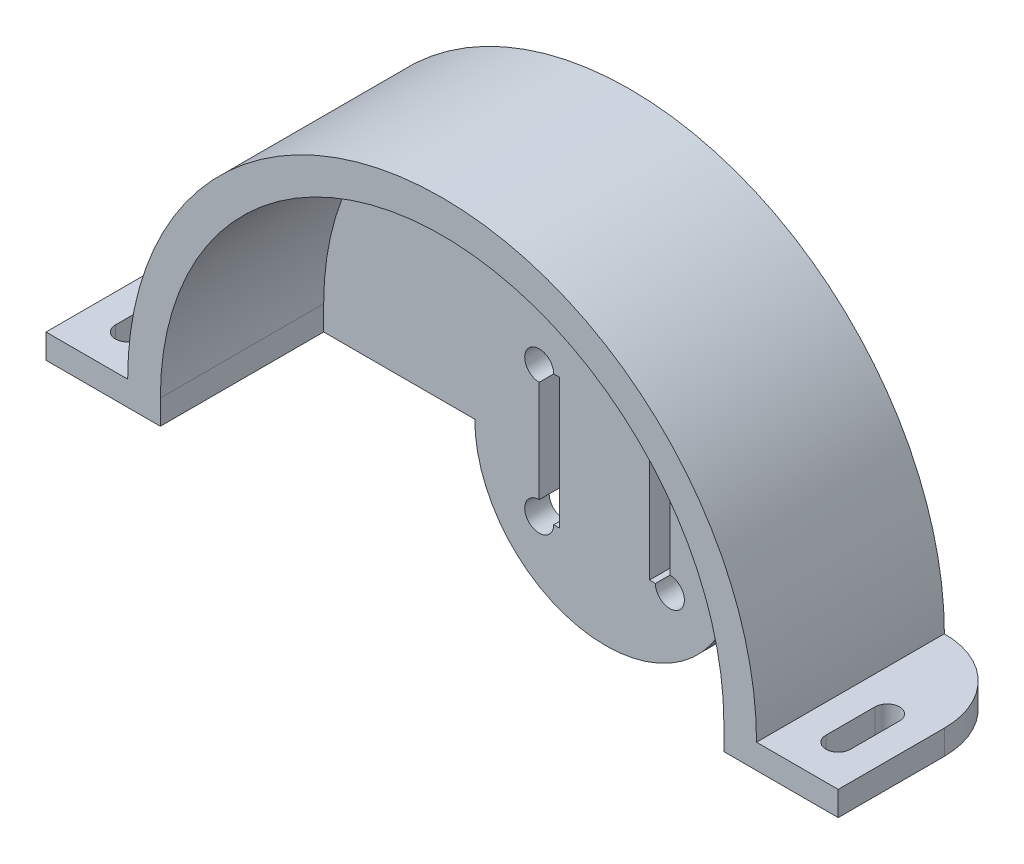
ISO-10303-21;
HEADER;
FILE_DESCRIPTION(('STEP AP214'),'2;1');
FILE_NAME('part.step','',(''),(''),'','','');
FILE_SCHEMA(('AUTOMOTIVE_DESIGN { 1 0 10303 214 1 1 1 1 }'));
ENDSEC;
DATA;
#1=APPLICATION_CONTEXT('core data for automotive mechanical design processes');
#2=APPLICATION_PROTOCOL_DEFINITION('international standard','automotive_design',2000,#1);
#3=PRODUCT_CONTEXT('',#1,'mechanical');
#4=PRODUCT('Part','Part','',(#3));
#5=PRODUCT_RELATED_PRODUCT_CATEGORY('part','',(#4));
#6=PRODUCT_DEFINITION_FORMATION('','',#4);
#7=PRODUCT_DEFINITION_CONTEXT('part definition',#1,'design');
#8=PRODUCT_DEFINITION('design','',#6,#7);
#9=PRODUCT_DEFINITION_SHAPE('','',#8);
#10=(LENGTH_UNIT() NAMED_UNIT(*) SI_UNIT(.MILLI.,.METRE.));
#11=(NAMED_UNIT(*) PLANE_ANGLE_UNIT() SI_UNIT($,.RADIAN.));
#12=(NAMED_UNIT(*) SI_UNIT($,.STERADIAN.) SOLID_ANGLE_UNIT());
#13=UNCERTAINTY_MEASURE_WITH_UNIT(LENGTH_MEASURE(1.E-05),#10,'distance_accuracy_value','');
#14=(GEOMETRIC_REPRESENTATION_CONTEXT(3) GLOBAL_UNCERTAINTY_ASSIGNED_CONTEXT((#13)) GLOBAL_UNIT_ASSIGNED_CONTEXT((#10,
#11,#12)) REPRESENTATION_CONTEXT('',''));
#15=CARTESIAN_POINT('',(0.,0.,0.));
#16=DIRECTION('',(0.,0.,1.));
#17=DIRECTION('',(1.,0.,0.));
#18=AXIS2_PLACEMENT_3D('',#15,#16,#17);
#19=CARTESIAN_POINT('',(0.,-3.,3.));
#20=DIRECTION('',(0.,1.,0.));
#21=DIRECTION('',(0.,0.,1.));
#22=AXIS2_PLACEMENT_3D('',#19,#20,#21);
#23=PLANE('',#22);
#24=DIRECTION('',(0.,0.,1.));
#25=VECTOR('',#24,1.);
#26=CARTESIAN_POINT('',(90.5,-3.,3.));
#27=LINE('',#26,#25);
#28=CARTESIAN_POINT('',(90.5,-3.,12.));
#29=VERTEX_POINT('',#28);
#30=CARTESIAN_POINT('',(90.5,-3.,18.));
#31=VERTEX_POINT('',#30);
#32=EDGE_CURVE('E413',#29,#31,#27,.T.);
#33=ORIENTED_EDGE('',*,*,#32,.T.);
#34=CARTESIAN_POINT('',(92.,-3.,18.));
#35=DIRECTION('',(0.,1.,0.));
#36=DIRECTION('',(0.,0.,1.));
#37=AXIS2_PLACEMENT_3D('',#34,#35,#36);
#38=CIRCLE('',#37,1.5);
#39=CARTESIAN_POINT('',(93.5,-3.,18.));
#40=VERTEX_POINT('',#39);
#41=EDGE_CURVE('E416',#31,#40,#38,.T.);
#42=ORIENTED_EDGE('',*,*,#41,.T.);
#43=DIRECTION('',(0.,0.,-1.));
#44=VECTOR('',#43,1.);
#45=CARTESIAN_POINT('',(93.5,-3.,3.));
#46=LINE('',#45,#44);
#47=CARTESIAN_POINT('',(93.5,-3.,12.));
#48=VERTEX_POINT('',#47);
#49=EDGE_CURVE('E383',#40,#48,#46,.T.);
#50=ORIENTED_EDGE('',*,*,#49,.T.);
#51=CARTESIAN_POINT('',(92.,-3.,12.));
#52=DIRECTION('',(0.,1.,0.));
#53=DIRECTION('',(0.,0.,1.));
#54=AXIS2_PLACEMENT_3D('',#51,#52,#53);
#55=CIRCLE('',#54,1.5);
#56=EDGE_CURVE('E410',#48,#29,#55,.T.);
#57=ORIENTED_EDGE('',*,*,#56,.T.);
#58=EDGE_LOOP('',(#33,#42,#50,#57));
#59=FACE_BOUND('',#58,.T.);
#60=DIRECTION('',(1.,0.,0.));
#61=VECTOR('',#60,1.);
#62=CARTESIAN_POINT('',(0.,-3.,0.));
#63=LINE('',#62,#61);
#64=CARTESIAN_POINT('',(64.5,-3.00000000000001,0.));
#65=VERTEX_POINT('',#64);
#66=CARTESIAN_POINT('',(87.,-3.,0.));
#67=VERTEX_POINT('',#66);
#68=EDGE_CURVE('E486',#65,#67,#63,.T.);
#69=ORIENTED_EDGE('',*,*,#68,.T.);
#70=CARTESIAN_POINT('',(87.,-3.,10.));
#71=DIRECTION('',(0.,1.,0.));
#72=DIRECTION('',(0.,0.,1.));
#73=AXIS2_PLACEMENT_3D('',#70,#71,#72);
#74=CIRCLE('',#73,10.);
#75=CARTESIAN_POINT('',(97.,-3.,10.));
#76=VERTEX_POINT('',#75);
#77=EDGE_CURVE('E549',#67,#76,#74,.F.);
#78=ORIENTED_EDGE('',*,*,#77,.T.);
#79=DIRECTION('',(0.,0.,-1.));
#80=VECTOR('',#79,1.);
#81=CARTESIAN_POINT('',(97.,-3.,3.));
#82=LINE('',#81,#80);
#83=CARTESIAN_POINT('',(97.,-3.,23.));
#84=VERTEX_POINT('',#83);
#85=EDGE_CURVE('E494',#84,#76,#82,.T.);
#86=ORIENTED_EDGE('',*,*,#85,.F.);
#87=DIRECTION('',(1.,0.,0.));
#88=VECTOR('',#87,1.);
#89=CARTESIAN_POINT('',(0.,-3.,23.));
#90=LINE('',#89,#88);
#91=CARTESIAN_POINT('',(83.,-3.,23.));
#92=VERTEX_POINT('',#91);
#93=EDGE_CURVE('E440',#92,#84,#90,.T.);
#94=ORIENTED_EDGE('',*,*,#93,.F.);
#95=DIRECTION('',(0.,0.,-1.));
#96=VECTOR('',#95,1.);
#97=CARTESIAN_POINT('',(83.,-3.,23.));
#98=LINE('',#97,#96);
#99=CARTESIAN_POINT('',(83.,-3.,3.));
#100=VERTEX_POINT('',#99);
#101=EDGE_CURVE('E469',#92,#100,#98,.T.);
#102=ORIENTED_EDGE('',*,*,#101,.T.);
#103=DIRECTION('',(1.,0.,0.));
#104=VECTOR('',#103,1.);
#105=CARTESIAN_POINT('',(0.,-3.,3.));
#106=LINE('',#105,#104);
#107=CARTESIAN_POINT('',(64.5,-3.,3.));
#108=VERTEX_POINT('',#107);
#109=EDGE_CURVE('E483',#108,#100,#106,.T.);
#110=ORIENTED_EDGE('',*,*,#109,.F.);
#111=DIRECTION('',(0.,0.,-1.));
#112=VECTOR('',#111,1.);
#113=CARTESIAN_POINT('',(64.5,-3.00000000000001,3.));
#114=LINE('',#113,#112);
#115=EDGE_CURVE('E426',#108,#65,#114,.T.);
#116=ORIENTED_EDGE('',*,*,#115,.T.);
#117=EDGE_LOOP('',(#69,#78,#86,#94,#102,#110,#116));
#118=FACE_BOUND('',#117,.T.);
#119=ADVANCED_FACE('F75',(#59,#118),#23,.F.);
#120=CARTESIAN_POINT('',(48.5,0.,3.));
#121=DIRECTION('',(0.,0.,-1.));
#122=DIRECTION('',(-1.,0.,0.));
#123=AXIS2_PLACEMENT_3D('',#120,#121,#122);
#124=CYLINDRICAL_SURFACE('',#123,38.5);
#125=CARTESIAN_POINT('',(48.5,0.,0.));
#126=DIRECTION('',(0.,0.,1.));
#127=DIRECTION('',(1.,0.,0.));
#128=AXIS2_PLACEMENT_3D('',#125,#126,#127);
#129=CIRCLE('',#128,38.5);
#130=CARTESIAN_POINT('',(10.,0.,0.));
#131=VERTEX_POINT('',#130);
#132=CARTESIAN_POINT('',(87.,0.,0.));
#133=VERTEX_POINT('',#132);
#134=EDGE_CURVE('E478',#131,#133,#129,.F.);
#135=ORIENTED_EDGE('',*,*,#134,.F.);
#136=DIRECTION('',(0.,0.,-1.));
#137=VECTOR('',#136,1.);
#138=CARTESIAN_POINT('',(10.,0.,3.));
#139=LINE('',#138,#137);
#140=CARTESIAN_POINT('',(10.,0.,23.));
#141=VERTEX_POINT('',#140);
#142=EDGE_CURVE('E501',#141,#131,#139,.T.);
#143=ORIENTED_EDGE('',*,*,#142,.F.);
#144=CARTESIAN_POINT('',(48.5,0.,23.));
#145=DIRECTION('',(0.,0.,1.));
#146=DIRECTION('',(1.,0.,0.));
#147=AXIS2_PLACEMENT_3D('',#144,#145,#146);
#148=CIRCLE('',#147,38.5);
#149=CARTESIAN_POINT('',(87.,0.,23.));
#150=VERTEX_POINT('',#149);
#151=EDGE_CURVE('E449',#150,#141,#148,.T.);
#152=ORIENTED_EDGE('',*,*,#151,.F.);
#153=DIRECTION('',(0.,0.,-1.));
#154=VECTOR('',#153,1.);
#155=CARTESIAN_POINT('',(87.,0.,3.));
#156=LINE('',#155,#154);
#157=EDGE_CURVE('E482',#150,#133,#156,.T.);
#158=ORIENTED_EDGE('',*,*,#157,.T.);
#159=EDGE_LOOP('',(#135,#143,#152,#158));
#160=FACE_BOUND('',#159,.T.);
#161=ADVANCED_FACE('F568',(#160),#124,.T.);
#162=CARTESIAN_POINT('',(0.,0.,3.));
#163=DIRECTION('',(0.,1.,0.));
#164=DIRECTION('',(0.,0.,1.));
#165=AXIS2_PLACEMENT_3D('',#162,#163,#164);
#166=PLANE('',#165);
#167=CARTESIAN_POINT('',(5.,0.,18.));
#168=DIRECTION('',(0.,1.,0.));
#169=DIRECTION('',(-1.,0.,0.));
#170=AXIS2_PLACEMENT_3D('',#167,#168,#169);
#171=CIRCLE('',#170,1.5);
#172=CARTESIAN_POINT('',(3.5,0.,18.));
#173=VERTEX_POINT('',#172);
#174=CARTESIAN_POINT('',(6.5,0.,18.));
#175=VERTEX_POINT('',#174);
#176=EDGE_CURVE('E368',#173,#175,#171,.T.);
#177=ORIENTED_EDGE('',*,*,#176,.F.);
#178=DIRECTION('',(0.,0.,1.));
#179=VECTOR('',#178,1.);
#180=CARTESIAN_POINT('',(3.5,0.,18.));
#181=LINE('',#180,#179);
#182=CARTESIAN_POINT('',(3.5,0.,12.));
#183=VERTEX_POINT('',#182);
#184=EDGE_CURVE('E377',#183,#173,#181,.T.);
#185=ORIENTED_EDGE('',*,*,#184,.F.);
#186=CARTESIAN_POINT('',(5.,0.,12.));
#187=DIRECTION('',(0.,1.,0.));
#188=DIRECTION('',(-1.,0.,0.));
#189=AXIS2_PLACEMENT_3D('',#186,#187,#188);
#190=CIRCLE('',#189,1.5);
#191=CARTESIAN_POINT('',(6.5,0.,12.));
#192=VERTEX_POINT('',#191);
#193=EDGE_CURVE('E374',#192,#183,#190,.T.);
#194=ORIENTED_EDGE('',*,*,#193,.F.);
#195=DIRECTION('',(0.,0.,-1.));
#196=VECTOR('',#195,1.);
#197=CARTESIAN_POINT('',(6.5,0.,18.));
#198=LINE('',#197,#196);
#199=EDGE_CURVE('E370',#175,#192,#198,.T.);
#200=ORIENTED_EDGE('',*,*,#199,.F.);
#201=EDGE_LOOP('',(#177,#185,#194,#200));
#202=FACE_BOUND('',#201,.T.);
#203=ORIENTED_EDGE('',*,*,#142,.T.);
#204=CARTESIAN_POINT('',(10.,0.,10.));
#205=DIRECTION('',(0.,1.,0.));
#206=DIRECTION('',(0.,0.,1.));
#207=AXIS2_PLACEMENT_3D('',#204,#205,#206);
#208=CIRCLE('',#207,10.);
#209=CARTESIAN_POINT('',(0.,0.,10.));
#210=VERTEX_POINT('',#209);
#211=EDGE_CURVE('E12',#131,#210,#208,.T.);
#212=ORIENTED_EDGE('',*,*,#211,.T.);
#213=DIRECTION('',(0.,0.,-1.));
#214=VECTOR('',#213,1.);
#215=CARTESIAN_POINT('',(0.,0.,3.));
#216=LINE('',#215,#214);
#217=CARTESIAN_POINT('',(0.,0.,23.));
#218=VERTEX_POINT('',#217);
#219=EDGE_CURVE('E499',#218,#210,#216,.T.);
#220=ORIENTED_EDGE('',*,*,#219,.F.);
#221=DIRECTION('',(1.,0.,0.));
#222=VECTOR('',#221,1.);
#223=CARTESIAN_POINT('',(0.,0.,23.));
#224=LINE('',#223,#222);
#225=EDGE_CURVE('E452',#218,#141,#224,.T.);
#226=ORIENTED_EDGE('',*,*,#225,.T.);
#227=EDGE_LOOP('',(#203,#212,#220,#226));
#228=FACE_BOUND('',#227,.T.);
#229=ADVANCED_FACE('F564',(#202,#228),#166,.T.);
#230=CARTESIAN_POINT('',(0.,0.,3.));
#231=DIRECTION('',(1.,0.,0.));
#232=DIRECTION('',(0.,1.,0.));
#233=AXIS2_PLACEMENT_3D('',#230,#231,#232);
#234=PLANE('',#233);
#235=ORIENTED_EDGE('',*,*,#219,.T.);
#236=DIRECTION('',(0.,-1.,0.));
#237=VECTOR('',#236,1.);
#238=CARTESIAN_POINT('',(0.,0.,10.));
#239=LINE('',#238,#237);
#240=CARTESIAN_POINT('',(0.,-3.,10.));
#241=VERTEX_POINT('',#240);
#242=EDGE_CURVE('E555',#210,#241,#239,.T.);
#243=ORIENTED_EDGE('',*,*,#242,.T.);
#244=DIRECTION('',(0.,0.,-1.));
#245=VECTOR('',#244,1.);
#246=CARTESIAN_POINT('',(0.,-3.,3.));
#247=LINE('',#246,#245);
#248=CARTESIAN_POINT('',(0.,-3.,23.));
#249=VERTEX_POINT('',#248);
#250=EDGE_CURVE('E497',#249,#241,#247,.T.);
#251=ORIENTED_EDGE('',*,*,#250,.F.);
#252=DIRECTION('',(0.,-1.,0.));
#253=VECTOR('',#252,1.);
#254=CARTESIAN_POINT('',(0.,0.,23.));
#255=LINE('',#254,#253);
#256=EDGE_CURVE('E455',#218,#249,#255,.T.);
#257=ORIENTED_EDGE('',*,*,#256,.F.);
#258=EDGE_LOOP('',(#235,#243,#251,#257));
#259=FACE_BOUND('',#258,.T.);
#260=ADVANCED_FACE('F571',(#259),#234,.F.);
#261=DIRECTION('',(0.,0.,1.));
#262=VECTOR('',#261,1.);
#263=CARTESIAN_POINT('',(3.5,-3.,3.));
#264=LINE('',#263,#262);
#265=CARTESIAN_POINT('',(3.5,-3.,12.));
#266=VERTEX_POINT('',#265);
#267=CARTESIAN_POINT('',(3.5,-3.,18.));
#268=VERTEX_POINT('',#267);
#269=EDGE_CURVE('E509',#266,#268,#264,.T.);
#270=ORIENTED_EDGE('',*,*,#269,.T.);
#271=CARTESIAN_POINT('',(5.,-3.,18.));
#272=DIRECTION('',(0.,1.,0.));
#273=DIRECTION('',(0.,0.,1.));
#274=AXIS2_PLACEMENT_3D('',#271,#272,#273);
#275=CIRCLE('',#274,1.5);
#276=CARTESIAN_POINT('',(6.5,-3.,18.));
#277=VERTEX_POINT('',#276);
#278=EDGE_CURVE('E512',#268,#277,#275,.T.);
#279=ORIENTED_EDGE('',*,*,#278,.T.);
#280=DIRECTION('',(0.,0.,-1.));
#281=VECTOR('',#280,1.);
#282=CARTESIAN_POINT('',(6.5,-3.,3.));
#283=LINE('',#282,#281);
#284=CARTESIAN_POINT('',(6.5,-3.,12.));
#285=VERTEX_POINT('',#284);
#286=EDGE_CURVE('E503',#277,#285,#283,.T.);
#287=ORIENTED_EDGE('',*,*,#286,.T.);
#288=CARTESIAN_POINT('',(5.,-3.,12.));
#289=DIRECTION('',(0.,1.,0.));
#290=DIRECTION('',(0.,0.,1.));
#291=AXIS2_PLACEMENT_3D('',#288,#289,#290);
#292=CIRCLE('',#291,1.5);
#293=EDGE_CURVE('E506',#285,#266,#292,.T.);
#294=ORIENTED_EDGE('',*,*,#293,.T.);
#295=EDGE_LOOP('',(#270,#279,#287,#294));
#296=FACE_BOUND('',#295,.T.);
#297=ORIENTED_EDGE('',*,*,#250,.T.);
#298=CARTESIAN_POINT('',(10.,-3.,10.));
#299=DIRECTION('',(0.,1.,0.));
#300=DIRECTION('',(0.,0.,1.));
#301=AXIS2_PLACEMENT_3D('',#298,#299,#300);
#302=CIRCLE('',#301,10.);
#303=CARTESIAN_POINT('',(10.,-3.,0.));
#304=VERTEX_POINT('',#303);
#305=EDGE_CURVE('E90',#241,#304,#302,.F.);
#306=ORIENTED_EDGE('',*,*,#305,.T.);
#307=CARTESIAN_POINT('',(32.5,-3.,0.));
#308=VERTEX_POINT('',#307);
#309=EDGE_CURVE('E487',#304,#308,#63,.T.);
#310=ORIENTED_EDGE('',*,*,#309,.T.);
#311=DIRECTION('',(0.,0.,-1.));
#312=VECTOR('',#311,1.);
#313=CARTESIAN_POINT('',(32.5,-3.00000000000001,3.));
#314=LINE('',#313,#312);
#315=CARTESIAN_POINT('',(32.5,-3.,3.));
#316=VERTEX_POINT('',#315);
#317=EDGE_CURVE('E423',#316,#308,#314,.T.);
#318=ORIENTED_EDGE('',*,*,#317,.F.);
#319=CARTESIAN_POINT('',(14.,-3.,3.));
#320=VERTEX_POINT('',#319);
#321=EDGE_CURVE('E479',#320,#316,#106,.T.);
#322=ORIENTED_EDGE('',*,*,#321,.F.);
#323=DIRECTION('',(0.,0.,-1.));
#324=VECTOR('',#323,1.);
#325=CARTESIAN_POINT('',(14.,-3.,23.));
#326=LINE('',#325,#324);
#327=CARTESIAN_POINT('',(14.,-3.,23.));
#328=VERTEX_POINT('',#327);
#329=EDGE_CURVE('E460',#328,#320,#326,.T.);
#330=ORIENTED_EDGE('',*,*,#329,.F.);
#331=DIRECTION('',(1.,0.,0.));
#332=VECTOR('',#331,1.);
#333=CARTESIAN_POINT('',(0.,-3.,23.));
#334=LINE('',#333,#332);
#335=EDGE_CURVE('E458',#249,#328,#334,.T.);
#336=ORIENTED_EDGE('',*,*,#335,.F.);
#337=EDGE_LOOP('',(#297,#306,#310,#318,#322,#330,#336));
#338=FACE_BOUND('',#337,.T.);
#339=ADVANCED_FACE('F574',(#296,#338),#23,.F.);
#340=CARTESIAN_POINT('',(97.,0.,3.));
#341=DIRECTION('',(1.,0.,0.));
#342=DIRECTION('',(0.,0.,-1.));
#343=AXIS2_PLACEMENT_3D('',#340,#341,#342);
#344=PLANE('',#343);
#345=ORIENTED_EDGE('',*,*,#85,.T.);
#346=DIRECTION('',(0.,-1.,0.));
#347=VECTOR('',#346,1.);
#348=CARTESIAN_POINT('',(97.,0.,10.));
#349=LINE('',#348,#347);
#350=CARTESIAN_POINT('',(97.,0.,10.));
#351=VERTEX_POINT('',#350);
#352=EDGE_CURVE('E551',#76,#351,#349,.F.);
#353=ORIENTED_EDGE('',*,*,#352,.T.);
#354=DIRECTION('',(0.,0.,-1.));
#355=VECTOR('',#354,1.);
#356=CARTESIAN_POINT('',(97.,0.,3.));
#357=LINE('',#356,#355);
#358=CARTESIAN_POINT('',(97.,0.,23.));
#359=VERTEX_POINT('',#358);
#360=EDGE_CURVE('E491',#359,#351,#357,.T.);
#361=ORIENTED_EDGE('',*,*,#360,.F.);
#362=DIRECTION('',(0.,1.,0.));
#363=VECTOR('',#362,1.);
#364=CARTESIAN_POINT('',(97.,0.,23.));
#365=LINE('',#364,#363);
#366=EDGE_CURVE('E443',#84,#359,#365,.T.);
#367=ORIENTED_EDGE('',*,*,#366,.F.);
#368=EDGE_LOOP('',(#345,#353,#361,#367));
#369=FACE_BOUND('',#368,.T.);
#370=ADVANCED_FACE('F609',(#369),#344,.T.);
#371=CARTESIAN_POINT('',(0.,0.,3.));
#372=DIRECTION('',(0.,1.,0.));
#373=DIRECTION('',(0.,0.,1.));
#374=AXIS2_PLACEMENT_3D('',#371,#372,#373);
#375=PLANE('',#374);
#376=CARTESIAN_POINT('',(92.,0.,18.));
#377=DIRECTION('',(0.,1.,0.));
#378=DIRECTION('',(-1.,0.,0.));
#379=AXIS2_PLACEMENT_3D('',#376,#377,#378);
#380=CIRCLE('',#379,1.5);
#381=CARTESIAN_POINT('',(90.5,0.,18.));
#382=VERTEX_POINT('',#381);
#383=CARTESIAN_POINT('',(93.5,0.,18.));
#384=VERTEX_POINT('',#383);
#385=EDGE_CURVE('E371',#382,#384,#380,.T.);
#386=ORIENTED_EDGE('',*,*,#385,.F.);
#387=DIRECTION('',(0.,0.,1.));
#388=VECTOR('',#387,1.);
#389=CARTESIAN_POINT('',(90.5,0.,18.));
#390=LINE('',#389,#388);
#391=CARTESIAN_POINT('',(90.5,0.,12.));
#392=VERTEX_POINT('',#391);
#393=EDGE_CURVE('E393',#392,#382,#390,.T.);
#394=ORIENTED_EDGE('',*,*,#393,.F.);
#395=CARTESIAN_POINT('',(92.,0.,12.));
#396=DIRECTION('',(0.,1.,0.));
#397=DIRECTION('',(-1.,0.,0.));
#398=AXIS2_PLACEMENT_3D('',#395,#396,#397);
#399=CIRCLE('',#398,1.5);
#400=CARTESIAN_POINT('',(93.5,0.,12.));
#401=VERTEX_POINT('',#400);
#402=EDGE_CURVE('E401',#401,#392,#399,.T.);
#403=ORIENTED_EDGE('',*,*,#402,.F.);
#404=DIRECTION('',(0.,0.,-1.));
#405=VECTOR('',#404,1.);
#406=CARTESIAN_POINT('',(93.5,0.,18.));
#407=LINE('',#406,#405);
#408=EDGE_CURVE('E404',#384,#401,#407,.T.);
#409=ORIENTED_EDGE('',*,*,#408,.F.);
#410=EDGE_LOOP('',(#386,#394,#403,#409));
#411=FACE_BOUND('',#410,.T.);
#412=ORIENTED_EDGE('',*,*,#360,.T.);
#413=CARTESIAN_POINT('',(87.,0.,10.));
#414=DIRECTION('',(0.,1.,0.));
#415=DIRECTION('',(0.,0.,1.));
#416=AXIS2_PLACEMENT_3D('',#413,#414,#415);
#417=CIRCLE('',#416,10.);
#418=EDGE_CURVE('E553',#351,#133,#417,.T.);
#419=ORIENTED_EDGE('',*,*,#418,.T.);
#420=ORIENTED_EDGE('',*,*,#157,.F.);
#421=DIRECTION('',(-1.,0.,0.));
#422=VECTOR('',#421,1.);
#423=CARTESIAN_POINT('',(0.,0.,23.));
#424=LINE('',#423,#422);
#425=EDGE_CURVE('E446',#359,#150,#424,.T.);
#426=ORIENTED_EDGE('',*,*,#425,.F.);
#427=EDGE_LOOP('',(#412,#419,#420,#426));
#428=FACE_BOUND('',#427,.T.);
#429=ADVANCED_FACE('F583',(#411,#428),#375,.T.);
#430=CARTESIAN_POINT('',(0.,0.,3.));
#431=DIRECTION('',(0.,0.,1.));
#432=DIRECTION('',(1.,0.,0.));
#433=AXIS2_PLACEMENT_3D('',#430,#431,#432);
#434=PLANE('',#433);
#435=CARTESIAN_POINT('',(40.390134319681,-9.36000000000001,3.));
#436=DIRECTION('',(0.,0.,1.));
#437=DIRECTION('',(1.,0.,0.));
#438=AXIS2_PLACEMENT_3D('',#435,#436,#437);
#439=CIRCLE('',#438,1.775);
#440=CARTESIAN_POINT('',(40.390134319681,-7.58500000000001,3.));
#441=VERTEX_POINT('',#440);
#442=CARTESIAN_POINT('',(42.165134319681,-9.36000000000001,3.));
#443=VERTEX_POINT('',#442);
#444=EDGE_CURVE('E310',#441,#443,#439,.T.);
#445=ORIENTED_EDGE('',*,*,#444,.F.);
#446=DIRECTION('',(0.,-1.,0.));
#447=VECTOR('',#446,1.);
#448=CARTESIAN_POINT('',(40.390134319681,0.,3.));
#449=LINE('',#448,#447);
#450=CARTESIAN_POINT('',(40.390134319681,4.86499999999999,3.));
#451=VERTEX_POINT('',#450);
#452=EDGE_CURVE('E324',#451,#441,#449,.T.);
#453=ORIENTED_EDGE('',*,*,#452,.F.);
#454=CARTESIAN_POINT('',(40.390134319681,6.63999999999999,3.));
#455=DIRECTION('',(0.,0.,1.));
#456=DIRECTION('',(1.,0.,0.));
#457=AXIS2_PLACEMENT_3D('',#454,#455,#456);
#458=CIRCLE('',#457,1.77499999999999);
#459=CARTESIAN_POINT('',(42.165134319681,6.63999999999999,3.));
#460=VERTEX_POINT('',#459);
#461=EDGE_CURVE('E318',#460,#451,#458,.T.);
#462=ORIENTED_EDGE('',*,*,#461,.F.);
#463=DIRECTION('',(1.,0.,0.));
#464=VECTOR('',#463,1.);
#465=CARTESIAN_POINT('',(0.,6.63999999999999,3.));
#466=LINE('',#465,#464);
#467=CARTESIAN_POINT('',(42.890134319681,6.63999999999999,3.));
#468=VERTEX_POINT('',#467);
#469=EDGE_CURVE('E316',#460,#468,#466,.T.);
#470=ORIENTED_EDGE('',*,*,#469,.T.);
#471=DIRECTION('',(0.,-1.,0.));
#472=VECTOR('',#471,1.);
#473=CARTESIAN_POINT('',(42.890134319681,0.,3.));
#474=LINE('',#473,#472);
#475=CARTESIAN_POINT('',(42.890134319681,-9.36000000000001,3.));
#476=VERTEX_POINT('',#475);
#477=EDGE_CURVE('E294',#468,#476,#474,.T.);
#478=ORIENTED_EDGE('',*,*,#477,.T.);
#479=DIRECTION('',(1.,0.,0.));
#480=VECTOR('',#479,1.);
#481=CARTESIAN_POINT('',(0.,-9.36000000000001,3.));
#482=LINE('',#481,#480);
#483=EDGE_CURVE('E305',#443,#476,#482,.T.);
#484=ORIENTED_EDGE('',*,*,#483,.F.);
#485=EDGE_LOOP('',(#445,#453,#462,#470,#478,#484));
#486=FACE_BOUND('',#485,.T.);
#487=DIRECTION('',(0.,1.,0.));
#488=VECTOR('',#487,1.);
#489=CARTESIAN_POINT('',(56.390134319681,-9.36000000000001,3.));
#490=LINE('',#489,#488);
#491=CARTESIAN_POINT('',(56.390134319681,-7.58500000000001,3.));
#492=VERTEX_POINT('',#491);
#493=CARTESIAN_POINT('',(56.390134319681,4.86499999999999,3.));
#494=VERTEX_POINT('',#493);
#495=EDGE_CURVE('E353',#492,#494,#490,.T.);
#496=ORIENTED_EDGE('',*,*,#495,.F.);
#497=CARTESIAN_POINT('',(56.390134319681,-9.36000000000001,3.));
#498=DIRECTION('',(0.,0.,1.));
#499=DIRECTION('',(1.,0.,0.));
#500=AXIS2_PLACEMENT_3D('',#497,#498,#499);
#501=CIRCLE('',#500,1.775);
#502=CARTESIAN_POINT('',(54.615134319681,-9.36000000000001,3.));
#503=VERTEX_POINT('',#502);
#504=EDGE_CURVE('E348',#503,#492,#501,.T.);
#505=ORIENTED_EDGE('',*,*,#504,.F.);
#506=DIRECTION('',(-1.,0.,0.));
#507=VECTOR('',#506,1.);
#508=CARTESIAN_POINT('',(56.390134319681,-9.36000000000001,3.));
#509=LINE('',#508,#507);
#510=CARTESIAN_POINT('',(53.890134319681,-9.36000000000001,3.));
#511=VERTEX_POINT('',#510);
#512=EDGE_CURVE('E362',#503,#511,#509,.T.);
#513=ORIENTED_EDGE('',*,*,#512,.T.);
#514=DIRECTION('',(0.,1.,0.));
#515=VECTOR('',#514,1.);
#516=CARTESIAN_POINT('',(53.890134319681,-9.36000000000001,3.));
#517=LINE('',#516,#515);
#518=CARTESIAN_POINT('',(53.890134319681,6.63999999999999,3.));
#519=VERTEX_POINT('',#518);
#520=EDGE_CURVE('E359',#511,#519,#517,.T.);
#521=ORIENTED_EDGE('',*,*,#520,.T.);
#522=DIRECTION('',(-1.,0.,0.));
#523=VECTOR('',#522,1.);
#524=CARTESIAN_POINT('',(56.390134319681,6.63999999999999,3.));
#525=LINE('',#524,#523);
#526=CARTESIAN_POINT('',(54.615134319681,6.63999999999999,3.));
#527=VERTEX_POINT('',#526);
#528=EDGE_CURVE('E356',#527,#519,#525,.T.);
#529=ORIENTED_EDGE('',*,*,#528,.F.);
#530=CARTESIAN_POINT('',(56.390134319681,6.63999999999999,3.));
#531=DIRECTION('',(0.,0.,1.));
#532=DIRECTION('',(1.,0.,0.));
#533=AXIS2_PLACEMENT_3D('',#530,#531,#532);
#534=CIRCLE('',#533,1.77499999999999);
#535=EDGE_CURVE('E341',#494,#527,#534,.T.);
#536=ORIENTED_EDGE('',*,*,#535,.F.);
#537=EDGE_LOOP('',(#496,#505,#513,#521,#529,#536));
#538=FACE_BOUND('',#537,.T.);
#539=CARTESIAN_POINT('',(48.5,0.,3.));
#540=DIRECTION('',(0.,0.,1.));
#541=DIRECTION('',(1.,0.,0.));
#542=AXIS2_PLACEMENT_3D('',#539,#540,#541);
#543=CIRCLE('',#542,34.5);
#544=CARTESIAN_POINT('',(14.,0.,3.));
#545=VERTEX_POINT('',#544);
#546=CARTESIAN_POINT('',(83.,0.,3.));
#547=VERTEX_POINT('',#546);
#548=EDGE_CURVE('E462',#545,#547,#543,.F.);
#549=ORIENTED_EDGE('',*,*,#548,.F.);
#550=DIRECTION('',(0.,-1.,0.));
#551=VECTOR('',#550,1.);
#552=CARTESIAN_POINT('',(14.,0.,3.));
#553=LINE('',#552,#551);
#554=EDGE_CURVE('E429',#545,#320,#553,.T.);
#555=ORIENTED_EDGE('',*,*,#554,.T.);
#556=ORIENTED_EDGE('',*,*,#321,.T.);
#557=CARTESIAN_POINT('',(48.5,-3.00000000000001,3.));
#558=DIRECTION('',(0.,0.,-1.));
#559=DIRECTION('',(-1.,0.,0.));
#560=AXIS2_PLACEMENT_3D('',#557,#558,#559);
#561=CIRCLE('',#560,16.);
#562=EDGE_CURVE('E420',#108,#316,#561,.T.);
#563=ORIENTED_EDGE('',*,*,#562,.F.);
#564=ORIENTED_EDGE('',*,*,#109,.T.);
#565=DIRECTION('',(0.,-1.,0.));
#566=VECTOR('',#565,1.);
#567=CARTESIAN_POINT('',(83.,0.,3.));
#568=LINE('',#567,#566);
#569=EDGE_CURVE('E436',#547,#100,#568,.T.);
#570=ORIENTED_EDGE('',*,*,#569,.F.);
#571=EDGE_LOOP('',(#549,#555,#556,#563,#564,#570));
#572=FACE_BOUND('',#571,.T.);
#573=ADVANCED_FACE('F312',(#486,#538,#572),#434,.T.);
#574=CARTESIAN_POINT('',(0.,0.,0.));
#575=DIRECTION('',(0.,0.,1.));
#576=DIRECTION('',(1.,0.,0.));
#577=AXIS2_PLACEMENT_3D('',#574,#575,#576);
#578=PLANE('',#577);
#579=DIRECTION('',(0.,-1.,0.));
#580=VECTOR('',#579,1.);
#581=CARTESIAN_POINT('',(40.390134319681,0.,0.));
#582=LINE('',#581,#580);
#583=CARTESIAN_POINT('',(40.390134319681,4.86499999999999,0.));
#584=VERTEX_POINT('',#583);
#585=CARTESIAN_POINT('',(40.390134319681,-7.58500000000001,0.));
#586=VERTEX_POINT('',#585);
#587=EDGE_CURVE('E540',#584,#586,#582,.T.);
#588=ORIENTED_EDGE('',*,*,#587,.T.);
#589=CARTESIAN_POINT('',(40.390134319681,-9.36000000000001,0.));
#590=DIRECTION('',(0.,0.,1.));
#591=DIRECTION('',(1.,0.,0.));
#592=AXIS2_PLACEMENT_3D('',#589,#590,#591);
#593=CIRCLE('',#592,1.775);
#594=CARTESIAN_POINT('',(42.165134319681,-9.36000000000001,0.));
#595=VERTEX_POINT('',#594);
#596=EDGE_CURVE('E543',#586,#595,#593,.T.);
#597=ORIENTED_EDGE('',*,*,#596,.T.);
#598=DIRECTION('',(1.,0.,0.));
#599=VECTOR('',#598,1.);
#600=CARTESIAN_POINT('',(0.,-9.36000000000001,0.));
#601=LINE('',#600,#599);
#602=CARTESIAN_POINT('',(42.890134319681,-9.36000000000001,0.));
#603=VERTEX_POINT('',#602);
#604=EDGE_CURVE('E532',#595,#603,#601,.T.);
#605=ORIENTED_EDGE('',*,*,#604,.T.);
#606=DIRECTION('',(0.,-1.,0.));
#607=VECTOR('',#606,1.);
#608=CARTESIAN_POINT('',(42.890134319681,0.,0.));
#609=LINE('',#608,#607);
#610=CARTESIAN_POINT('',(42.890134319681,6.63999999999999,0.));
#611=VERTEX_POINT('',#610);
#612=EDGE_CURVE('E297',#611,#603,#609,.T.);
#613=ORIENTED_EDGE('',*,*,#612,.F.);
#614=DIRECTION('',(1.,0.,0.));
#615=VECTOR('',#614,1.);
#616=CARTESIAN_POINT('',(0.,6.63999999999999,0.));
#617=LINE('',#616,#615);
#618=CARTESIAN_POINT('',(42.165134319681,6.63999999999999,0.));
#619=VERTEX_POINT('',#618);
#620=EDGE_CURVE('E535',#619,#611,#617,.T.);
#621=ORIENTED_EDGE('',*,*,#620,.F.);
#622=CARTESIAN_POINT('',(40.390134319681,6.63999999999999,0.));
#623=DIRECTION('',(0.,0.,1.));
#624=DIRECTION('',(1.,0.,0.));
#625=AXIS2_PLACEMENT_3D('',#622,#623,#624);
#626=CIRCLE('',#625,1.77499999999999);
#627=EDGE_CURVE('E537',#619,#584,#626,.T.);
#628=ORIENTED_EDGE('',*,*,#627,.T.);
#629=EDGE_LOOP('',(#588,#597,#605,#613,#621,#628));
#630=FACE_BOUND('',#629,.T.);
#631=CARTESIAN_POINT('',(56.390134319681,-9.36000000000001,0.));
#632=DIRECTION('',(0.,0.,1.));
#633=DIRECTION('',(1.,0.,0.));
#634=AXIS2_PLACEMENT_3D('',#631,#632,#633);
#635=CIRCLE('',#634,1.775);
#636=CARTESIAN_POINT('',(54.615134319681,-9.36000000000001,0.));
#637=VERTEX_POINT('',#636);
#638=CARTESIAN_POINT('',(56.390134319681,-7.58500000000001,0.));
#639=VERTEX_POINT('',#638);
#640=EDGE_CURVE('E523',#637,#639,#635,.T.);
#641=ORIENTED_EDGE('',*,*,#640,.T.);
#642=DIRECTION('',(0.,1.,0.));
#643=VECTOR('',#642,1.);
#644=CARTESIAN_POINT('',(56.390134319681,0.,0.));
#645=LINE('',#644,#643);
#646=CARTESIAN_POINT('',(56.390134319681,4.86499999999999,0.));
#647=VERTEX_POINT('',#646);
#648=EDGE_CURVE('E529',#639,#647,#645,.T.);
#649=ORIENTED_EDGE('',*,*,#648,.T.);
#650=CARTESIAN_POINT('',(56.390134319681,6.63999999999999,0.));
#651=DIRECTION('',(0.,0.,1.));
#652=DIRECTION('',(1.,0.,0.));
#653=AXIS2_PLACEMENT_3D('',#650,#651,#652);
#654=CIRCLE('',#653,1.77499999999999);
#655=CARTESIAN_POINT('',(54.615134319681,6.63999999999999,0.));
#656=VERTEX_POINT('',#655);
#657=EDGE_CURVE('E526',#647,#656,#654,.T.);
#658=ORIENTED_EDGE('',*,*,#657,.T.);
#659=DIRECTION('',(-1.,0.,0.));
#660=VECTOR('',#659,1.);
#661=CARTESIAN_POINT('',(0.,6.63999999999999,0.));
#662=LINE('',#661,#660);
#663=CARTESIAN_POINT('',(53.890134319681,6.63999999999999,0.));
#664=VERTEX_POINT('',#663);
#665=EDGE_CURVE('E515',#656,#664,#662,.T.);
#666=ORIENTED_EDGE('',*,*,#665,.T.);
#667=DIRECTION('',(0.,1.,0.));
#668=VECTOR('',#667,1.);
#669=CARTESIAN_POINT('',(53.890134319681,0.,0.));
#670=LINE('',#669,#668);
#671=CARTESIAN_POINT('',(53.890134319681,-9.36000000000001,0.));
#672=VERTEX_POINT('',#671);
#673=EDGE_CURVE('E518',#672,#664,#670,.T.);
#674=ORIENTED_EDGE('',*,*,#673,.F.);
#675=DIRECTION('',(-1.,0.,0.));
#676=VECTOR('',#675,1.);
#677=CARTESIAN_POINT('',(0.,-9.36000000000001,0.));
#678=LINE('',#677,#676);
#679=EDGE_CURVE('E521',#637,#672,#678,.T.);
#680=ORIENTED_EDGE('',*,*,#679,.F.);
#681=EDGE_LOOP('',(#641,#649,#658,#666,#674,#680));
#682=FACE_BOUND('',#681,.T.);
#683=ORIENTED_EDGE('',*,*,#309,.F.);
#684=DIRECTION('',(0.,-1.,0.));
#685=VECTOR('',#684,1.);
#686=CARTESIAN_POINT('',(10.,0.,0.));
#687=LINE('',#686,#685);
#688=EDGE_CURVE('E83',#304,#131,#687,.F.);
#689=ORIENTED_EDGE('',*,*,#688,.T.);
#690=ORIENTED_EDGE('',*,*,#134,.T.);
#691=DIRECTION('',(0.,-1.,0.));
#692=VECTOR('',#691,1.);
#693=CARTESIAN_POINT('',(87.,-3.,0.));
#694=LINE('',#693,#692);
#695=EDGE_CURVE('E546',#133,#67,#694,.T.);
#696=ORIENTED_EDGE('',*,*,#695,.T.);
#697=ORIENTED_EDGE('',*,*,#68,.F.);
#698=CARTESIAN_POINT('',(48.5,-3.00000000000001,0.));
#699=DIRECTION('',(0.,0.,-1.));
#700=DIRECTION('',(-1.,0.,0.));
#701=AXIS2_PLACEMENT_3D('',#698,#699,#700);
#702=CIRCLE('',#701,16.);
#703=EDGE_CURVE('E419',#65,#308,#702,.T.);
#704=ORIENTED_EDGE('',*,*,#703,.T.);
#705=EDGE_LOOP('',(#683,#689,#690,#696,#697,#704));
#706=FACE_BOUND('',#705,.T.);
#707=ADVANCED_FACE('F560',(#630,#682,#706),#578,.F.);
#708=CARTESIAN_POINT('',(14.,0.,23.));
#709=DIRECTION('',(1.,0.,0.));
#710=DIRECTION('',(0.,1.,0.));
#711=AXIS2_PLACEMENT_3D('',#708,#709,#710);
#712=PLANE('',#711);
#713=ORIENTED_EDGE('',*,*,#554,.F.);
#714=DIRECTION('',(0.,0.,-1.));
#715=VECTOR('',#714,1.);
#716=CARTESIAN_POINT('',(14.,0.,23.));
#717=LINE('',#716,#715);
#718=CARTESIAN_POINT('',(14.,0.,23.));
#719=VERTEX_POINT('',#718);
#720=EDGE_CURVE('E475',#719,#545,#717,.T.);
#721=ORIENTED_EDGE('',*,*,#720,.F.);
#722=DIRECTION('',(0.,-1.,0.));
#723=VECTOR('',#722,1.);
#724=CARTESIAN_POINT('',(14.,0.,23.));
#725=LINE('',#724,#723);
#726=EDGE_CURVE('E432',#719,#328,#725,.T.);
#727=ORIENTED_EDGE('',*,*,#726,.T.);
#728=ORIENTED_EDGE('',*,*,#329,.T.);
#729=EDGE_LOOP('',(#713,#721,#727,#728));
#730=FACE_BOUND('',#729,.T.);
#731=ADVANCED_FACE('F598',(#730),#712,.T.);
#732=CARTESIAN_POINT('',(48.5,0.,23.));
#733=DIRECTION('',(0.,0.,-1.));
#734=DIRECTION('',(-1.,0.,0.));
#735=AXIS2_PLACEMENT_3D('',#732,#733,#734);
#736=CYLINDRICAL_SURFACE('',#735,34.5);
#737=ORIENTED_EDGE('',*,*,#548,.T.);
#738=DIRECTION('',(0.,0.,-1.));
#739=VECTOR('',#738,1.);
#740=CARTESIAN_POINT('',(83.,0.,23.));
#741=LINE('',#740,#739);
#742=CARTESIAN_POINT('',(83.,0.,23.));
#743=VERTEX_POINT('',#742);
#744=EDGE_CURVE('E472',#743,#547,#741,.T.);
#745=ORIENTED_EDGE('',*,*,#744,.F.);
#746=CARTESIAN_POINT('',(48.5,0.,23.));
#747=DIRECTION('',(0.,0.,1.));
#748=DIRECTION('',(1.,0.,0.));
#749=AXIS2_PLACEMENT_3D('',#746,#747,#748);
#750=CIRCLE('',#749,34.5);
#751=EDGE_CURVE('E435',#719,#743,#750,.F.);
#752=ORIENTED_EDGE('',*,*,#751,.F.);
#753=ORIENTED_EDGE('',*,*,#720,.T.);
#754=EDGE_LOOP('',(#737,#745,#752,#753));
#755=FACE_BOUND('',#754,.T.);
#756=ADVANCED_FACE('F602',(#755),#736,.F.);
#757=CARTESIAN_POINT('',(83.,0.,23.));
#758=DIRECTION('',(1.,0.,0.));
#759=DIRECTION('',(0.,0.,-1.));
#760=AXIS2_PLACEMENT_3D('',#757,#758,#759);
#761=PLANE('',#760);
#762=ORIENTED_EDGE('',*,*,#569,.T.);
#763=ORIENTED_EDGE('',*,*,#101,.F.);
#764=DIRECTION('',(0.,-1.,0.));
#765=VECTOR('',#764,1.);
#766=CARTESIAN_POINT('',(83.,0.,23.));
#767=LINE('',#766,#765);
#768=EDGE_CURVE('E438',#743,#92,#767,.T.);
#769=ORIENTED_EDGE('',*,*,#768,.F.);
#770=ORIENTED_EDGE('',*,*,#744,.T.);
#771=EDGE_LOOP('',(#762,#763,#769,#770));
#772=FACE_BOUND('',#771,.T.);
#773=ADVANCED_FACE('F607',(#772),#761,.F.);
#774=CARTESIAN_POINT('',(0.,0.,23.));
#775=DIRECTION('',(0.,0.,1.));
#776=DIRECTION('',(1.,0.,0.));
#777=AXIS2_PLACEMENT_3D('',#774,#775,#776);
#778=PLANE('',#777);
#779=ORIENTED_EDGE('',*,*,#726,.F.);
#780=ORIENTED_EDGE('',*,*,#751,.T.);
#781=ORIENTED_EDGE('',*,*,#768,.T.);
#782=ORIENTED_EDGE('',*,*,#93,.T.);
#783=ORIENTED_EDGE('',*,*,#366,.T.);
#784=ORIENTED_EDGE('',*,*,#425,.T.);
#785=ORIENTED_EDGE('',*,*,#151,.T.);
#786=ORIENTED_EDGE('',*,*,#225,.F.);
#787=ORIENTED_EDGE('',*,*,#256,.T.);
#788=ORIENTED_EDGE('',*,*,#335,.T.);
#789=EDGE_LOOP('',(#779,#780,#781,#782,#783,#784,#785,#786,#787,#788));
#790=FACE_BOUND('',#789,.T.);
#791=ADVANCED_FACE('F579',(#790),#778,.T.);
#792=CARTESIAN_POINT('',(48.5,-3.00000000000001,3.));
#793=DIRECTION('',(0.,0.,-1.));
#794=DIRECTION('',(-1.,0.,0.));
#795=AXIS2_PLACEMENT_3D('',#792,#793,#794);
#796=CYLINDRICAL_SURFACE('',#795,16.);
#797=ORIENTED_EDGE('',*,*,#703,.F.);
#798=ORIENTED_EDGE('',*,*,#115,.F.);
#799=ORIENTED_EDGE('',*,*,#562,.T.);
#800=ORIENTED_EDGE('',*,*,#317,.T.);
#801=EDGE_LOOP('',(#797,#798,#799,#800));
#802=FACE_BOUND('',#801,.T.);
#803=ADVANCED_FACE('F594',(#802),#796,.T.);
#804=CARTESIAN_POINT('',(92.,-10.,18.));
#805=DIRECTION('',(0.,1.,0.));
#806=DIRECTION('',(-1.,0.,0.));
#807=AXIS2_PLACEMENT_3D('',#804,#805,#806);
#808=CYLINDRICAL_SURFACE('',#807,1.5);
#809=DIRECTION('',(0.,1.,0.));
#810=VECTOR('',#809,1.);
#811=CARTESIAN_POINT('',(90.5,-10.,18.));
#812=LINE('',#811,#810);
#813=EDGE_CURVE('E329',#31,#382,#812,.T.);
#814=ORIENTED_EDGE('',*,*,#813,.T.);
#815=ORIENTED_EDGE('',*,*,#385,.T.);
#816=DIRECTION('',(0.,1.,0.));
#817=VECTOR('',#816,1.);
#818=CARTESIAN_POINT('',(93.5,-10.,18.));
#819=LINE('',#818,#817);
#820=EDGE_CURVE('E390',#40,#384,#819,.T.);
#821=ORIENTED_EDGE('',*,*,#820,.F.);
#822=ORIENTED_EDGE('',*,*,#41,.F.);
#823=EDGE_LOOP('',(#814,#815,#821,#822));
#824=FACE_BOUND('',#823,.T.);
#825=ADVANCED_FACE('F690',(#824),#808,.F.);
#826=CARTESIAN_POINT('',(90.5,-10.,18.));
#827=DIRECTION('',(-1.,0.,0.));
#828=DIRECTION('',(0.,-1.,0.));
#829=AXIS2_PLACEMENT_3D('',#826,#827,#828);
#830=PLANE('',#829);
#831=DIRECTION('',(0.,1.,0.));
#832=VECTOR('',#831,1.);
#833=CARTESIAN_POINT('',(90.5,-10.,12.));
#834=LINE('',#833,#832);
#835=EDGE_CURVE('E396',#29,#392,#834,.T.);
#836=ORIENTED_EDGE('',*,*,#835,.T.);
#837=ORIENTED_EDGE('',*,*,#393,.T.);
#838=ORIENTED_EDGE('',*,*,#813,.F.);
#839=ORIENTED_EDGE('',*,*,#32,.F.);
#840=EDGE_LOOP('',(#836,#837,#838,#839));
#841=FACE_BOUND('',#840,.T.);
#842=ADVANCED_FACE('F693',(#841),#830,.F.);
#843=CARTESIAN_POINT('',(92.,-10.,12.));
#844=DIRECTION('',(0.,1.,0.));
#845=DIRECTION('',(-1.,0.,0.));
#846=AXIS2_PLACEMENT_3D('',#843,#844,#845);
#847=CYLINDRICAL_SURFACE('',#846,1.5);
#848=DIRECTION('',(0.,1.,0.));
#849=VECTOR('',#848,1.);
#850=CARTESIAN_POINT('',(93.5,-10.,12.));
#851=LINE('',#850,#849);
#852=EDGE_CURVE('E394',#48,#401,#851,.T.);
#853=ORIENTED_EDGE('',*,*,#852,.T.);
#854=ORIENTED_EDGE('',*,*,#402,.T.);
#855=ORIENTED_EDGE('',*,*,#835,.F.);
#856=ORIENTED_EDGE('',*,*,#56,.F.);
#857=EDGE_LOOP('',(#853,#854,#855,#856));
#858=FACE_BOUND('',#857,.T.);
#859=ADVANCED_FACE('F697',(#858),#847,.F.);
#860=CARTESIAN_POINT('',(93.5,-10.,18.));
#861=DIRECTION('',(1.,0.,0.));
#862=DIRECTION('',(0.,1.,0.));
#863=AXIS2_PLACEMENT_3D('',#860,#861,#862);
#864=PLANE('',#863);
#865=ORIENTED_EDGE('',*,*,#820,.T.);
#866=ORIENTED_EDGE('',*,*,#408,.T.);
#867=ORIENTED_EDGE('',*,*,#852,.F.);
#868=ORIENTED_EDGE('',*,*,#49,.F.);
#869=EDGE_LOOP('',(#865,#866,#867,#868));
#870=FACE_BOUND('',#869,.T.);
#871=ADVANCED_FACE('F688',(#870),#864,.F.);
#872=CARTESIAN_POINT('',(5.,-10.,18.));
#873=DIRECTION('',(0.,1.,0.));
#874=DIRECTION('',(-1.,0.,0.));
#875=AXIS2_PLACEMENT_3D('',#872,#873,#874);
#876=CYLINDRICAL_SURFACE('',#875,1.5);
#877=DIRECTION('',(0.,1.,0.));
#878=VECTOR('',#877,1.);
#879=CARTESIAN_POINT('',(3.5,-10.,18.));
#880=LINE('',#879,#878);
#881=EDGE_CURVE('E381',#268,#173,#880,.T.);
#882=ORIENTED_EDGE('',*,*,#881,.T.);
#883=ORIENTED_EDGE('',*,*,#176,.T.);
#884=DIRECTION('',(0.,1.,0.));
#885=VECTOR('',#884,1.);
#886=CARTESIAN_POINT('',(6.5,-10.,18.));
#887=LINE('',#886,#885);
#888=EDGE_CURVE('E380',#277,#175,#887,.T.);
#889=ORIENTED_EDGE('',*,*,#888,.F.);
#890=ORIENTED_EDGE('',*,*,#278,.F.);
#891=EDGE_LOOP('',(#882,#883,#889,#890));
#892=FACE_BOUND('',#891,.T.);
#893=ADVANCED_FACE('F678',(#892),#876,.F.);
#894=CARTESIAN_POINT('',(3.5,-10.,18.));
#895=DIRECTION('',(-1.,0.,0.));
#896=DIRECTION('',(0.,-1.,0.));
#897=AXIS2_PLACEMENT_3D('',#894,#895,#896);
#898=PLANE('',#897);
#899=DIRECTION('',(0.,1.,0.));
#900=VECTOR('',#899,1.);
#901=CARTESIAN_POINT('',(3.5,-10.,12.));
#902=LINE('',#901,#900);
#903=EDGE_CURVE('E384',#266,#183,#902,.T.);
#904=ORIENTED_EDGE('',*,*,#903,.T.);
#905=ORIENTED_EDGE('',*,*,#184,.T.);
#906=ORIENTED_EDGE('',*,*,#881,.F.);
#907=ORIENTED_EDGE('',*,*,#269,.F.);
#908=EDGE_LOOP('',(#904,#905,#906,#907));
#909=FACE_BOUND('',#908,.T.);
#910=ADVANCED_FACE('F674',(#909),#898,.F.);
#911=CARTESIAN_POINT('',(5.,-10.,12.));
#912=DIRECTION('',(0.,1.,0.));
#913=DIRECTION('',(-1.,0.,0.));
#914=AXIS2_PLACEMENT_3D('',#911,#912,#913);
#915=CYLINDRICAL_SURFACE('',#914,1.5);
#916=DIRECTION('',(0.,1.,0.));
#917=VECTOR('',#916,1.);
#918=CARTESIAN_POINT('',(6.5,-10.,12.));
#919=LINE('',#918,#917);
#920=EDGE_CURVE('E386',#285,#192,#919,.T.);
#921=ORIENTED_EDGE('',*,*,#920,.T.);
#922=ORIENTED_EDGE('',*,*,#193,.T.);
#923=ORIENTED_EDGE('',*,*,#903,.F.);
#924=ORIENTED_EDGE('',*,*,#293,.F.);
#925=EDGE_LOOP('',(#921,#922,#923,#924));
#926=FACE_BOUND('',#925,.T.);
#927=ADVANCED_FACE('F677',(#926),#915,.F.);
#928=CARTESIAN_POINT('',(6.5,-10.,18.));
#929=DIRECTION('',(1.,0.,0.));
#930=DIRECTION('',(0.,1.,0.));
#931=AXIS2_PLACEMENT_3D('',#928,#929,#930);
#932=PLANE('',#931);
#933=ORIENTED_EDGE('',*,*,#888,.T.);
#934=ORIENTED_EDGE('',*,*,#199,.T.);
#935=ORIENTED_EDGE('',*,*,#920,.F.);
#936=ORIENTED_EDGE('',*,*,#286,.F.);
#937=EDGE_LOOP('',(#933,#934,#935,#936));
#938=FACE_BOUND('',#937,.T.);
#939=ADVANCED_FACE('F672',(#938),#932,.F.);
#940=CARTESIAN_POINT('',(56.390134319681,6.63999999999999,-7.));
#941=DIRECTION('',(0.,0.,1.));
#942=DIRECTION('',(1.,0.,0.));
#943=AXIS2_PLACEMENT_3D('',#940,#941,#942);
#944=CYLINDRICAL_SURFACE('',#943,1.77499999999999);
#945=DIRECTION('',(0.,0.,1.));
#946=VECTOR('',#945,1.);
#947=CARTESIAN_POINT('',(56.390134319681,4.86499999999999,-7.));
#948=LINE('',#947,#946);
#949=EDGE_CURVE('E339',#647,#494,#948,.T.);
#950=ORIENTED_EDGE('',*,*,#949,.T.);
#951=ORIENTED_EDGE('',*,*,#535,.T.);
#952=DIRECTION('',(0.,0.,1.));
#953=VECTOR('',#952,1.);
#954=CARTESIAN_POINT('',(54.615134319681,6.63999999999999,-7.));
#955=LINE('',#954,#953);
#956=EDGE_CURVE('E336',#527,#656,#955,.F.);
#957=ORIENTED_EDGE('',*,*,#956,.T.);
#958=ORIENTED_EDGE('',*,*,#657,.F.);
#959=EDGE_LOOP('',(#950,#951,#957,#958));
#960=FACE_BOUND('',#959,.T.);
#961=ADVANCED_FACE('F668',(#960),#944,.F.);
#962=CARTESIAN_POINT('',(56.390134319681,-9.36000000000001,-7.));
#963=DIRECTION('',(0.,0.,1.));
#964=DIRECTION('',(1.,0.,0.));
#965=AXIS2_PLACEMENT_3D('',#962,#963,#964);
#966=CYLINDRICAL_SURFACE('',#965,1.775);
#967=DIRECTION('',(0.,0.,1.));
#968=VECTOR('',#967,1.);
#969=CARTESIAN_POINT('',(54.615134319681,-9.36000000000001,-7.));
#970=LINE('',#969,#968);
#971=EDGE_CURVE('E342',#503,#637,#970,.F.);
#972=ORIENTED_EDGE('',*,*,#971,.F.);
#973=ORIENTED_EDGE('',*,*,#504,.T.);
#974=DIRECTION('',(0.,0.,1.));
#975=VECTOR('',#974,1.);
#976=CARTESIAN_POINT('',(56.390134319681,-7.58500000000001,-7.));
#977=LINE('',#976,#975);
#978=EDGE_CURVE('E345',#492,#639,#977,.F.);
#979=ORIENTED_EDGE('',*,*,#978,.T.);
#980=ORIENTED_EDGE('',*,*,#640,.F.);
#981=EDGE_LOOP('',(#972,#973,#979,#980));
#982=FACE_BOUND('',#981,.T.);
#983=ADVANCED_FACE('F664',(#982),#966,.F.);
#984=CARTESIAN_POINT('',(56.390134319681,-9.36000000000001,-7.));
#985=DIRECTION('',(1.,0.,0.));
#986=DIRECTION('',(0.,0.,-1.));
#987=AXIS2_PLACEMENT_3D('',#984,#985,#986);
#988=PLANE('',#987);
#989=ORIENTED_EDGE('',*,*,#978,.F.);
#990=ORIENTED_EDGE('',*,*,#495,.T.);
#991=ORIENTED_EDGE('',*,*,#949,.F.);
#992=ORIENTED_EDGE('',*,*,#648,.F.);
#993=EDGE_LOOP('',(#989,#990,#991,#992));
#994=FACE_BOUND('',#993,.T.);
#995=ADVANCED_FACE('F654',(#994),#988,.F.);
#996=CARTESIAN_POINT('',(56.390134319681,-9.36000000000001,-7.));
#997=DIRECTION('',(0.,1.,0.));
#998=DIRECTION('',(0.,0.,1.));
#999=AXIS2_PLACEMENT_3D('',#996,#997,#998);
#1000=PLANE('',#999);
#1001=ORIENTED_EDGE('',*,*,#679,.T.);
#1002=DIRECTION('',(0.,0.,1.));
#1003=VECTOR('',#1002,1.);
#1004=CARTESIAN_POINT('',(53.890134319681,-9.36000000000001,-7.));
#1005=LINE('',#1004,#1003);
#1006=EDGE_CURVE('E349',#672,#511,#1005,.T.);
#1007=ORIENTED_EDGE('',*,*,#1006,.T.);
#1008=ORIENTED_EDGE('',*,*,#512,.F.);
#1009=ORIENTED_EDGE('',*,*,#971,.T.);
#1010=EDGE_LOOP('',(#1001,#1007,#1008,#1009));
#1011=FACE_BOUND('',#1010,.T.);
#1012=ADVANCED_FACE('F650',(#1011),#1000,.T.);
#1013=CARTESIAN_POINT('',(53.890134319681,-9.36000000000001,-7.));
#1014=DIRECTION('',(1.,0.,0.));
#1015=DIRECTION('',(0.,0.,-1.));
#1016=AXIS2_PLACEMENT_3D('',#1013,#1014,#1015);
#1017=PLANE('',#1016);
#1018=ORIENTED_EDGE('',*,*,#673,.T.);
#1019=DIRECTION('',(0.,0.,1.));
#1020=VECTOR('',#1019,1.);
#1021=CARTESIAN_POINT('',(53.890134319681,6.63999999999999,-7.));
#1022=LINE('',#1021,#1020);
#1023=EDGE_CURVE('E351',#664,#519,#1022,.T.);
#1024=ORIENTED_EDGE('',*,*,#1023,.T.);
#1025=ORIENTED_EDGE('',*,*,#520,.F.);
#1026=ORIENTED_EDGE('',*,*,#1006,.F.);
#1027=EDGE_LOOP('',(#1018,#1024,#1025,#1026));
#1028=FACE_BOUND('',#1027,.T.);
#1029=ADVANCED_FACE('F653',(#1028),#1017,.T.);
#1030=CARTESIAN_POINT('',(56.390134319681,6.63999999999999,-7.));
#1031=DIRECTION('',(0.,1.,0.));
#1032=DIRECTION('',(0.,0.,1.));
#1033=AXIS2_PLACEMENT_3D('',#1030,#1031,#1032);
#1034=PLANE('',#1033);
#1035=ORIENTED_EDGE('',*,*,#956,.F.);
#1036=ORIENTED_EDGE('',*,*,#528,.T.);
#1037=ORIENTED_EDGE('',*,*,#1023,.F.);
#1038=ORIENTED_EDGE('',*,*,#665,.F.);
#1039=EDGE_LOOP('',(#1035,#1036,#1037,#1038));
#1040=FACE_BOUND('',#1039,.T.);
#1041=ADVANCED_FACE('F648',(#1040),#1034,.F.);
#1042=CARTESIAN_POINT('',(40.390134319681,-9.36000000000001,-7.));
#1043=DIRECTION('',(0.,0.,1.));
#1044=DIRECTION('',(1.,0.,0.));
#1045=AXIS2_PLACEMENT_3D('',#1042,#1043,#1044);
#1046=CYLINDRICAL_SURFACE('',#1045,1.775);
#1047=DIRECTION('',(0.,0.,1.));
#1048=VECTOR('',#1047,1.);
#1049=CARTESIAN_POINT('',(40.390134319681,-7.58500000000001,-7.));
#1050=LINE('',#1049,#1048);
#1051=EDGE_CURVE('E327',#586,#441,#1050,.T.);
#1052=ORIENTED_EDGE('',*,*,#1051,.T.);
#1053=ORIENTED_EDGE('',*,*,#444,.T.);
#1054=DIRECTION('',(0.,0.,1.));
#1055=VECTOR('',#1054,1.);
#1056=CARTESIAN_POINT('',(42.165134319681,-9.36000000000001,-7.));
#1057=LINE('',#1056,#1055);
#1058=EDGE_CURVE('E301',#595,#443,#1057,.T.);
#1059=ORIENTED_EDGE('',*,*,#1058,.F.);
#1060=ORIENTED_EDGE('',*,*,#596,.F.);
#1061=EDGE_LOOP('',(#1052,#1053,#1059,#1060));
#1062=FACE_BOUND('',#1061,.T.);
#1063=ADVANCED_FACE('F644',(#1062),#1046,.F.);
#1064=CARTESIAN_POINT('',(40.390134319681,0.,-7.));
#1065=DIRECTION('',(-1.,0.,0.));
#1066=DIRECTION('',(0.,0.,1.));
#1067=AXIS2_PLACEMENT_3D('',#1064,#1065,#1066);
#1068=PLANE('',#1067);
#1069=DIRECTION('',(0.,0.,1.));
#1070=VECTOR('',#1069,1.);
#1071=CARTESIAN_POINT('',(40.390134319681,4.86499999999999,-7.));
#1072=LINE('',#1071,#1070);
#1073=EDGE_CURVE('E330',#584,#451,#1072,.T.);
#1074=ORIENTED_EDGE('',*,*,#1073,.T.);
#1075=ORIENTED_EDGE('',*,*,#452,.T.);
#1076=ORIENTED_EDGE('',*,*,#1051,.F.);
#1077=ORIENTED_EDGE('',*,*,#587,.F.);
#1078=EDGE_LOOP('',(#1074,#1075,#1076,#1077));
#1079=FACE_BOUND('',#1078,.T.);
#1080=ADVANCED_FACE('F647',(#1079),#1068,.F.);
#1081=CARTESIAN_POINT('',(40.390134319681,6.63999999999999,-7.));
#1082=DIRECTION('',(0.,0.,1.));
#1083=DIRECTION('',(1.,0.,0.));
#1084=AXIS2_PLACEMENT_3D('',#1081,#1082,#1083);
#1085=CYLINDRICAL_SURFACE('',#1084,1.77499999999999);
#1086=DIRECTION('',(0.,0.,1.));
#1087=VECTOR('',#1086,1.);
#1088=CARTESIAN_POINT('',(42.165134319681,6.63999999999999,-7.));
#1089=LINE('',#1088,#1087);
#1090=EDGE_CURVE('E332',#619,#460,#1089,.T.);
#1091=ORIENTED_EDGE('',*,*,#1090,.T.);
#1092=ORIENTED_EDGE('',*,*,#461,.T.);
#1093=ORIENTED_EDGE('',*,*,#1073,.F.);
#1094=ORIENTED_EDGE('',*,*,#627,.F.);
#1095=EDGE_LOOP('',(#1091,#1092,#1093,#1094));
#1096=FACE_BOUND('',#1095,.T.);
#1097=ADVANCED_FACE('F738',(#1096),#1085,.F.);
#1098=CARTESIAN_POINT('',(0.,6.63999999999999,-7.));
#1099=DIRECTION('',(0.,-1.,0.));
#1100=DIRECTION('',(0.,0.,-1.));
#1101=AXIS2_PLACEMENT_3D('',#1098,#1099,#1100);
#1102=PLANE('',#1101);
#1103=ORIENTED_EDGE('',*,*,#620,.T.);
#1104=DIRECTION('',(0.,0.,1.));
#1105=VECTOR('',#1104,1.);
#1106=CARTESIAN_POINT('',(42.890134319681,6.63999999999999,-7.));
#1107=LINE('',#1106,#1105);
#1108=EDGE_CURVE('E300',#611,#468,#1107,.T.);
#1109=ORIENTED_EDGE('',*,*,#1108,.T.);
#1110=ORIENTED_EDGE('',*,*,#469,.F.);
#1111=ORIENTED_EDGE('',*,*,#1090,.F.);
#1112=EDGE_LOOP('',(#1103,#1109,#1110,#1111));
#1113=FACE_BOUND('',#1112,.T.);
#1114=ADVANCED_FACE('F640',(#1113),#1102,.T.);
#1115=CARTESIAN_POINT('',(42.890134319681,0.,-7.));
#1116=DIRECTION('',(-1.,0.,0.));
#1117=DIRECTION('',(0.,0.,1.));
#1118=AXIS2_PLACEMENT_3D('',#1115,#1116,#1117);
#1119=PLANE('',#1118);
#1120=ORIENTED_EDGE('',*,*,#612,.T.);
#1121=DIRECTION('',(0.,0.,1.));
#1122=VECTOR('',#1121,1.);
#1123=CARTESIAN_POINT('',(42.890134319681,-9.36000000000001,-7.));
#1124=LINE('',#1123,#1122);
#1125=EDGE_CURVE('E289',#603,#476,#1124,.T.);
#1126=ORIENTED_EDGE('',*,*,#1125,.T.);
#1127=ORIENTED_EDGE('',*,*,#477,.F.);
#1128=ORIENTED_EDGE('',*,*,#1108,.F.);
#1129=EDGE_LOOP('',(#1120,#1126,#1127,#1128));
#1130=FACE_BOUND('',#1129,.T.);
#1131=ADVANCED_FACE('F291',(#1130),#1119,.T.);
#1132=CARTESIAN_POINT('',(0.,-9.36000000000001,-7.));
#1133=DIRECTION('',(0.,-1.,0.));
#1134=DIRECTION('',(0.,0.,-1.));
#1135=AXIS2_PLACEMENT_3D('',#1132,#1133,#1134);
#1136=PLANE('',#1135);
#1137=ORIENTED_EDGE('',*,*,#1058,.T.);
#1138=ORIENTED_EDGE('',*,*,#483,.T.);
#1139=ORIENTED_EDGE('',*,*,#1125,.F.);
#1140=ORIENTED_EDGE('',*,*,#604,.F.);
#1141=EDGE_LOOP('',(#1137,#1138,#1139,#1140));
#1142=FACE_BOUND('',#1141,.T.);
#1143=ADVANCED_FACE('F306',(#1142),#1136,.F.);
#1144=CARTESIAN_POINT('',(87.,0.,10.));
#1145=DIRECTION('',(0.,1.,0.));
#1146=DIRECTION('',(0.,0.,1.));
#1147=AXIS2_PLACEMENT_3D('',#1144,#1145,#1146);
#1148=CYLINDRICAL_SURFACE('',#1147,10.);
#1149=ORIENTED_EDGE('',*,*,#418,.F.);
#1150=ORIENTED_EDGE('',*,*,#352,.F.);
#1151=ORIENTED_EDGE('',*,*,#77,.F.);
#1152=ORIENTED_EDGE('',*,*,#695,.F.);
#1153=EDGE_LOOP('',(#1149,#1150,#1151,#1152));
#1154=FACE_BOUND('',#1153,.T.);
#1155=ADVANCED_FACE('F587',(#1154),#1148,.T.);
#1156=CARTESIAN_POINT('',(10.,0.,10.));
#1157=DIRECTION('',(0.,-1.,0.));
#1158=DIRECTION('',(1.,0.,0.));
#1159=AXIS2_PLACEMENT_3D('',#1156,#1157,#1158);
#1160=CYLINDRICAL_SURFACE('',#1159,10.);
#1161=ORIENTED_EDGE('',*,*,#211,.F.);
#1162=ORIENTED_EDGE('',*,*,#688,.F.);
#1163=ORIENTED_EDGE('',*,*,#305,.F.);
#1164=ORIENTED_EDGE('',*,*,#242,.F.);
#1165=EDGE_LOOP('',(#1161,#1162,#1163,#1164));
#1166=FACE_BOUND('',#1165,.T.);
#1167=ADVANCED_FACE('F77',(#1166),#1160,.T.);
#1168=CLOSED_SHELL('',(#119,#161,#229,#260,#339,#370,#429,#573,#707,#731,#756,#773,#791,#803,
#825,#842,#859,#871,#893,#910,#927,#939,#961,#983,#995,#1012,#1029,#1041,#1063,#1080,#1097,
#1114,#1131,#1143,#1155,#1167));
#1169=MANIFOLD_SOLID_BREP('B2',#1168);
#1170=ADVANCED_BREP_SHAPE_REPRESENTATION('',(#18,#1169),#14);
#1171=SHAPE_DEFINITION_REPRESENTATION(#9,#1170);
ENDSEC;
END-ISO-10303-21;
